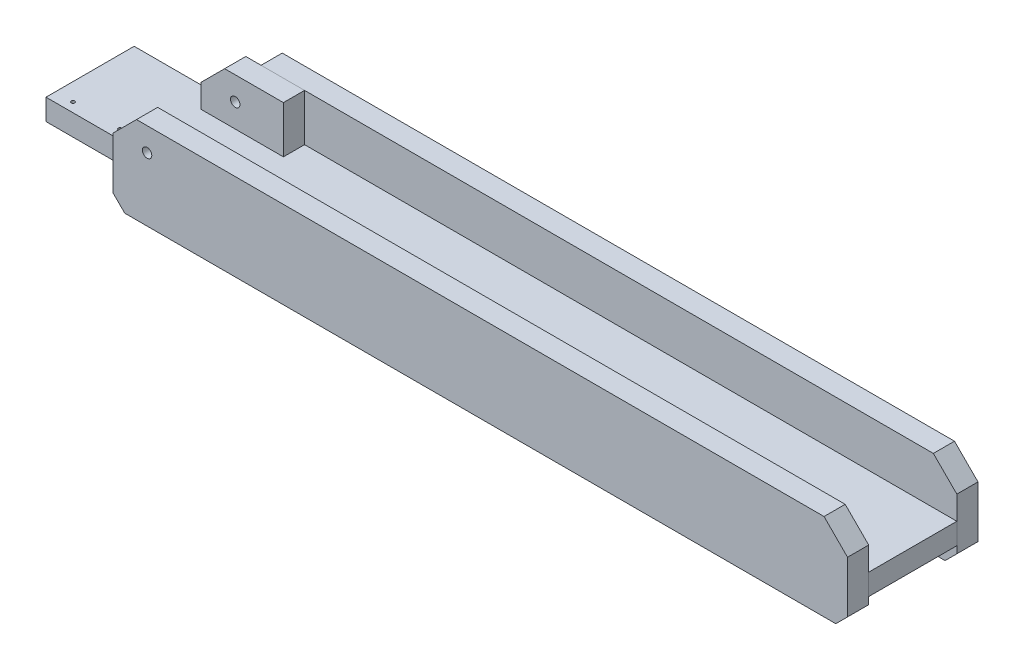
ISO-10303-21;
HEADER;
FILE_DESCRIPTION(('STEP AP214'),'2;1');
FILE_NAME('part.step','',(''),(''),'','','');
FILE_SCHEMA(('AUTOMOTIVE_DESIGN { 1 0 10303 214 1 1 1 1 }'));
ENDSEC;
DATA;
#1=APPLICATION_CONTEXT('core data for automotive mechanical design processes');
#2=APPLICATION_PROTOCOL_DEFINITION('international standard','automotive_design',2000,#1);
#3=PRODUCT_CONTEXT('',#1,'mechanical');
#4=PRODUCT('Part','Part','',(#3));
#5=PRODUCT_RELATED_PRODUCT_CATEGORY('part','',(#4));
#6=PRODUCT_DEFINITION_FORMATION('','',#4);
#7=PRODUCT_DEFINITION_CONTEXT('part definition',#1,'design');
#8=PRODUCT_DEFINITION('design','',#6,#7);
#9=PRODUCT_DEFINITION_SHAPE('','',#8);
#10=(LENGTH_UNIT() NAMED_UNIT(*) SI_UNIT(.MILLI.,.METRE.));
#11=(NAMED_UNIT(*) PLANE_ANGLE_UNIT() SI_UNIT($,.RADIAN.));
#12=(NAMED_UNIT(*) SI_UNIT($,.STERADIAN.) SOLID_ANGLE_UNIT());
#13=UNCERTAINTY_MEASURE_WITH_UNIT(LENGTH_MEASURE(1.E-05),#10,'distance_accuracy_value','');
#14=(GEOMETRIC_REPRESENTATION_CONTEXT(3) GLOBAL_UNCERTAINTY_ASSIGNED_CONTEXT((#13)) GLOBAL_UNIT_ASSIGNED_CONTEXT((#10,
#11,#12)) REPRESENTATION_CONTEXT('',''));
#15=CARTESIAN_POINT('',(0.,0.,0.));
#16=DIRECTION('',(0.,0.,1.));
#17=DIRECTION('',(1.,0.,0.));
#18=AXIS2_PLACEMENT_3D('',#15,#16,#17);
#19=CARTESIAN_POINT('',(379.872554582266,18.,-19.5));
#20=DIRECTION('',(0.,1.,0.));
#21=DIRECTION('',(0.,0.,1.));
#22=AXIS2_PLACEMENT_3D('',#19,#20,#21);
#23=PLANE('',#22);
#24=DIRECTION('',(1.,0.,0.));
#25=VECTOR('',#24,1.);
#26=CARTESIAN_POINT('',(379.872554582266,18.,-37.5));
#27=LINE('',#26,#25);
#28=CARTESIAN_POINT('',(75.,18.,-37.5));
#29=VERTEX_POINT('',#28);
#30=CARTESIAN_POINT('',(145.,18.,-37.5));
#31=VERTEX_POINT('',#30);
#32=EDGE_CURVE('E124',#29,#31,#27,.T.);
#33=ORIENTED_EDGE('',*,*,#32,.T.);
#34=DIRECTION('',(0.,0.,-1.));
#35=VECTOR('',#34,1.);
#36=CARTESIAN_POINT('',(145.,18.,-19.5));
#37=LINE('',#36,#35);
#38=CARTESIAN_POINT('',(145.,18.,-19.5));
#39=VERTEX_POINT('',#38);
#40=EDGE_CURVE('E12',#39,#31,#37,.T.);
#41=ORIENTED_EDGE('',*,*,#40,.F.);
#42=DIRECTION('',(1.,0.,0.));
#43=VECTOR('',#42,1.);
#44=CARTESIAN_POINT('',(379.872554582266,18.,-19.5));
#45=LINE('',#44,#43);
#46=CARTESIAN_POINT('',(75.,18.,-19.5));
#47=VERTEX_POINT('',#46);
#48=EDGE_CURVE('E140',#47,#39,#45,.T.);
#49=ORIENTED_EDGE('',*,*,#48,.F.);
#50=DIRECTION('',(0.,0.,-1.));
#51=VECTOR('',#50,1.);
#52=CARTESIAN_POINT('',(75.,18.,-19.5));
#53=LINE('',#52,#51);
#54=EDGE_CURVE('E117',#47,#29,#53,.T.);
#55=ORIENTED_EDGE('',*,*,#54,.T.);
#56=EDGE_LOOP('',(#33,#41,#49,#55));
#57=FACE_BOUND('',#56,.T.);
#58=ADVANCED_FACE('F46',(#57),#23,.F.);
#59=CARTESIAN_POINT('',(145.,-480.619058501836,-19.5));
#60=DIRECTION('',(-1.,0.,0.));
#61=DIRECTION('',(0.,0.,1.));
#62=AXIS2_PLACEMENT_3D('',#59,#60,#61);
#63=PLANE('',#62);
#64=DIRECTION('',(0.,1.,0.));
#65=VECTOR('',#64,1.);
#66=CARTESIAN_POINT('',(145.,-480.619058501836,-37.5));
#67=LINE('',#66,#65);
#68=CARTESIAN_POINT('',(145.,58.,-37.5));
#69=VERTEX_POINT('',#68);
#70=EDGE_CURVE('E127',#31,#69,#67,.T.);
#71=ORIENTED_EDGE('',*,*,#70,.T.);
#72=DIRECTION('',(0.,0.,-1.));
#73=VECTOR('',#72,1.);
#74=CARTESIAN_POINT('',(145.,58.,-19.5));
#75=LINE('',#74,#73);
#76=CARTESIAN_POINT('',(145.,58.,-19.5));
#77=VERTEX_POINT('',#76);
#78=EDGE_CURVE('E55',#77,#69,#75,.T.);
#79=ORIENTED_EDGE('',*,*,#78,.F.);
#80=DIRECTION('',(0.,1.,0.));
#81=VECTOR('',#80,1.);
#82=CARTESIAN_POINT('',(145.,-480.619058501836,-19.5));
#83=LINE('',#82,#81);
#84=EDGE_CURVE('E97',#39,#77,#83,.T.);
#85=ORIENTED_EDGE('',*,*,#84,.F.);
#86=ORIENTED_EDGE('',*,*,#40,.T.);
#87=EDGE_LOOP('',(#71,#79,#85,#86));
#88=FACE_BOUND('',#87,.T.);
#89=ADVANCED_FACE('F154',(#88),#63,.F.);
#90=CARTESIAN_POINT('',(379.872554582266,58.,-19.5));
#91=DIRECTION('',(0.,-1.,0.));
#92=DIRECTION('',(1.,0.,0.));
#93=AXIS2_PLACEMENT_3D('',#90,#91,#92);
#94=PLANE('',#93);
#95=DIRECTION('',(-1.,0.,0.));
#96=VECTOR('',#95,1.);
#97=CARTESIAN_POINT('',(379.872554582266,58.,-37.5));
#98=LINE('',#97,#96);
#99=CARTESIAN_POINT('',(95.0000000000001,57.9999999999999,-37.5));
#100=VERTEX_POINT('',#99);
#101=EDGE_CURVE('E112',#69,#100,#98,.T.);
#102=ORIENTED_EDGE('',*,*,#101,.T.);
#103=DIRECTION('',(0.,0.,-1.));
#104=VECTOR('',#103,1.);
#105=CARTESIAN_POINT('',(95.0000000000001,57.9999999999999,-19.5));
#106=LINE('',#105,#104);
#107=CARTESIAN_POINT('',(95.0000000000001,57.9999999999999,-19.5));
#108=VERTEX_POINT('',#107);
#109=EDGE_CURVE('E109',#108,#100,#106,.T.);
#110=ORIENTED_EDGE('',*,*,#109,.F.);
#111=DIRECTION('',(-1.,0.,0.));
#112=VECTOR('',#111,1.);
#113=CARTESIAN_POINT('',(379.872554582266,58.,-19.5));
#114=LINE('',#113,#112);
#115=EDGE_CURVE('E101',#77,#108,#114,.T.);
#116=ORIENTED_EDGE('',*,*,#115,.F.);
#117=ORIENTED_EDGE('',*,*,#78,.T.);
#118=EDGE_LOOP('',(#102,#110,#116,#117));
#119=FACE_BOUND('',#118,.T.);
#120=ADVANCED_FACE('F110',(#119),#94,.F.);
#121=CARTESIAN_POINT('',(-31.8732519597839,-68.8732519597835,-19.5));
#122=DIRECTION('',(0.707106781186546,-0.707106781186549,0.));
#123=DIRECTION('',(0.707106781186549,0.707106781186546,0.));
#124=AXIS2_PLACEMENT_3D('',#121,#122,#123);
#125=PLANE('',#124);
#126=DIRECTION('',(-0.707106781186549,-0.707106781186546,0.));
#127=VECTOR('',#126,1.);
#128=CARTESIAN_POINT('',(-31.8732519597839,-68.8732519597835,-37.5));
#129=LINE('',#128,#127);
#130=CARTESIAN_POINT('',(75.,37.9999999999999,-37.5));
#131=VERTEX_POINT('',#130);
#132=EDGE_CURVE('E83',#100,#131,#129,.T.);
#133=ORIENTED_EDGE('',*,*,#132,.T.);
#134=DIRECTION('',(0.,0.,-1.));
#135=VECTOR('',#134,1.);
#136=CARTESIAN_POINT('',(75.,37.9999999999999,-19.5));
#137=LINE('',#136,#135);
#138=CARTESIAN_POINT('',(75.,37.9999999999999,-19.5));
#139=VERTEX_POINT('',#138);
#140=EDGE_CURVE('E113',#139,#131,#137,.T.);
#141=ORIENTED_EDGE('',*,*,#140,.F.);
#142=DIRECTION('',(-0.707106781186549,-0.707106781186546,0.));
#143=VECTOR('',#142,1.);
#144=CARTESIAN_POINT('',(-31.8732519597839,-68.8732519597835,-19.5));
#145=LINE('',#144,#143);
#146=EDGE_CURVE('E105',#108,#139,#145,.T.);
#147=ORIENTED_EDGE('',*,*,#146,.F.);
#148=ORIENTED_EDGE('',*,*,#109,.T.);
#149=EDGE_LOOP('',(#133,#141,#147,#148));
#150=FACE_BOUND('',#149,.T.);
#151=ADVANCED_FACE('F115',(#150),#125,.F.);
#152=CARTESIAN_POINT('',(104.,38.,-19.5));
#153=DIRECTION('',(0.,0.,-1.));
#154=DIRECTION('',(-1.,0.,0.));
#155=AXIS2_PLACEMENT_3D('',#152,#153,#154);
#156=CYLINDRICAL_SURFACE('',#155,4.00000000000001);
#157=CARTESIAN_POINT('',(104.,38.,-19.5));
#158=DIRECTION('',(0.,0.,1.));
#159=DIRECTION('',(1.,0.,0.));
#160=AXIS2_PLACEMENT_3D('',#157,#158,#159);
#161=CIRCLE('',#160,4.00000000000001);
#162=CARTESIAN_POINT('',(108.,38.,-19.5));
#163=VERTEX_POINT('',#162);
#164=EDGE_CURVE('E132',#163,#163,#161,.F.);
#165=ORIENTED_EDGE('',*,*,#164,.F.);
#166=EDGE_LOOP('',(#165));
#167=FACE_BOUND('',#166,.T.);
#168=CARTESIAN_POINT('',(104.,38.,-37.5));
#169=DIRECTION('',(0.,0.,1.));
#170=DIRECTION('',(1.,0.,0.));
#171=AXIS2_PLACEMENT_3D('',#168,#169,#170);
#172=CIRCLE('',#171,4.00000000000001);
#173=CARTESIAN_POINT('',(108.,38.,-37.5));
#174=VERTEX_POINT('',#173);
#175=EDGE_CURVE('E121',#174,#174,#172,.F.);
#176=ORIENTED_EDGE('',*,*,#175,.T.);
#177=EDGE_LOOP('',(#176));
#178=FACE_BOUND('',#177,.T.);
#179=ADVANCED_FACE('F48',(#167,#178),#156,.F.);
#180=CARTESIAN_POINT('',(75.,-480.619058501836,-19.5));
#181=DIRECTION('',(1.,0.,0.));
#182=DIRECTION('',(0.,0.,-1.));
#183=AXIS2_PLACEMENT_3D('',#180,#181,#182);
#184=PLANE('',#183);
#185=DIRECTION('',(0.,-1.,0.));
#186=VECTOR('',#185,1.);
#187=CARTESIAN_POINT('',(75.,-480.619058501836,-37.5));
#188=LINE('',#187,#186);
#189=EDGE_CURVE('E89',#131,#29,#188,.T.);
#190=ORIENTED_EDGE('',*,*,#189,.T.);
#191=ORIENTED_EDGE('',*,*,#54,.F.);
#192=DIRECTION('',(0.,-1.,0.));
#193=VECTOR('',#192,1.);
#194=CARTESIAN_POINT('',(75.,-480.619058501836,-19.5));
#195=LINE('',#194,#193);
#196=EDGE_CURVE('E63',#139,#47,#195,.T.);
#197=ORIENTED_EDGE('',*,*,#196,.F.);
#198=ORIENTED_EDGE('',*,*,#140,.T.);
#199=EDGE_LOOP('',(#190,#191,#197,#198));
#200=FACE_BOUND('',#199,.T.);
#201=ADVANCED_FACE('F141',(#200),#184,.F.);
#202=CARTESIAN_POINT('',(379.872554582266,-480.619058501836,-19.5));
#203=DIRECTION('',(0.,0.,1.));
#204=DIRECTION('',(1.,0.,0.));
#205=AXIS2_PLACEMENT_3D('',#202,#203,#204);
#206=PLANE('',#205);
#207=ORIENTED_EDGE('',*,*,#164,.T.);
#208=EDGE_LOOP('',(#207));
#209=FACE_BOUND('',#208,.T.);
#210=ORIENTED_EDGE('',*,*,#48,.T.);
#211=ORIENTED_EDGE('',*,*,#84,.T.);
#212=ORIENTED_EDGE('',*,*,#115,.T.);
#213=ORIENTED_EDGE('',*,*,#146,.T.);
#214=ORIENTED_EDGE('',*,*,#196,.T.);
#215=EDGE_LOOP('',(#210,#211,#212,#213,#214));
#216=FACE_BOUND('',#215,.T.);
#217=ADVANCED_FACE('F103',(#209,#216),#206,.T.);
#218=CARTESIAN_POINT('',(379.872554582266,-480.619058501836,-37.5));
#219=DIRECTION('',(0.,0.,1.));
#220=DIRECTION('',(1.,0.,0.));
#221=AXIS2_PLACEMENT_3D('',#218,#219,#220);
#222=PLANE('',#221);
#223=ORIENTED_EDGE('',*,*,#175,.F.);
#224=EDGE_LOOP('',(#223));
#225=FACE_BOUND('',#224,.T.);
#226=ORIENTED_EDGE('',*,*,#32,.F.);
#227=ORIENTED_EDGE('',*,*,#189,.F.);
#228=ORIENTED_EDGE('',*,*,#132,.F.);
#229=ORIENTED_EDGE('',*,*,#101,.F.);
#230=ORIENTED_EDGE('',*,*,#70,.F.);
#231=EDGE_LOOP('',(#226,#227,#228,#229,#230));
#232=FACE_BOUND('',#231,.T.);
#233=ADVANCED_FACE('F136',(#225,#232),#222,.F.);
#234=CLOSED_SHELL('',(#58,#89,#120,#151,#179,#201,#217,#233));
#235=MANIFOLD_SOLID_BREP('B2',#234);
#236=CARTESIAN_POINT('',(700.,-16.,-55.5));
#237=DIRECTION('',(0.,0.,1.));
#238=DIRECTION('',(-1.,0.,0.));
#239=AXIS2_PLACEMENT_3D('',#236,#237,#238);
#240=PLANE('',#239);
#241=DIRECTION('',(0.,-1.,0.));
#242=VECTOR('',#241,1.);
#243=CARTESIAN_POINT('',(108.,57.9999999999999,-55.5));
#244=LINE('',#243,#242);
#245=CARTESIAN_POINT('',(108.,57.9999999999999,-55.5));
#246=VERTEX_POINT('',#245);
#247=CARTESIAN_POINT('',(108.,-16.0000000000001,-55.5));
#248=VERTEX_POINT('',#247);
#249=EDGE_CURVE('E254',#246,#248,#244,.T.);
#250=ORIENTED_EDGE('',*,*,#249,.F.);
#251=DIRECTION('',(-1.,0.,0.));
#252=VECTOR('',#251,1.);
#253=CARTESIAN_POINT('',(700.,58.,-55.5));
#254=LINE('',#253,#252);
#255=CARTESIAN_POINT('',(680.,58.,-55.5));
#256=VERTEX_POINT('',#255);
#257=EDGE_CURVE('E308',#256,#246,#254,.T.);
#258=ORIENTED_EDGE('',*,*,#257,.F.);
#259=DIRECTION('',(0.707106781186547,-0.707106781186549,0.));
#260=VECTOR('',#259,1.);
#261=CARTESIAN_POINT('',(680.,58.,-55.5));
#262=LINE('',#261,#260);
#263=CARTESIAN_POINT('',(700.,37.9999999999999,-55.5));
#264=VERTEX_POINT('',#263);
#265=EDGE_CURVE('E327',#264,#256,#262,.F.);
#266=ORIENTED_EDGE('',*,*,#265,.F.);
#267=DIRECTION('',(0.,1.,0.));
#268=VECTOR('',#267,1.);
#269=CARTESIAN_POINT('',(700.,58.,-55.5));
#270=LINE('',#269,#268);
#271=CARTESIAN_POINT('',(700.,-6.00000000000001,-55.5));
#272=VERTEX_POINT('',#271);
#273=EDGE_CURVE('E317',#272,#264,#270,.T.);
#274=ORIENTED_EDGE('',*,*,#273,.F.);
#275=DIRECTION('',(-0.707106781186551,-0.707106781186544,0.));
#276=VECTOR('',#275,1.);
#277=CARTESIAN_POINT('',(700.,-6.,-55.5));
#278=LINE('',#277,#276);
#279=CARTESIAN_POINT('',(690.,-16.,-55.5));
#280=VERTEX_POINT('',#279);
#281=EDGE_CURVE('E44',#280,#272,#278,.F.);
#282=ORIENTED_EDGE('',*,*,#281,.F.);
#283=DIRECTION('',(1.,0.,0.));
#284=VECTOR('',#283,1.);
#285=CARTESIAN_POINT('',(700.,-16.,-55.5));
#286=LINE('',#285,#284);
#287=EDGE_CURVE('E261',#248,#280,#286,.T.);
#288=ORIENTED_EDGE('',*,*,#287,.F.);
#289=EDGE_LOOP('',(#250,#258,#266,#274,#282,#288));
#290=FACE_BOUND('',#289,.T.);
#291=ADVANCED_FACE('F239',(#290),#240,.F.);
#292=CARTESIAN_POINT('',(700.,-16.,-37.5));
#293=DIRECTION('',(0.,0.,1.));
#294=DIRECTION('',(-1.,0.,0.));
#295=AXIS2_PLACEMENT_3D('',#292,#293,#294);
#296=PLANE('',#295);
#297=DIRECTION('',(-1.,0.,0.));
#298=VECTOR('',#297,1.);
#299=CARTESIAN_POINT('',(700.,58.,-37.5));
#300=LINE('',#299,#298);
#301=CARTESIAN_POINT('',(680.,58.,-37.5));
#302=VERTEX_POINT('',#301);
#303=CARTESIAN_POINT('',(108.,57.9999999999999,-37.5));
#304=VERTEX_POINT('',#303);
#305=EDGE_CURVE('E305',#302,#304,#300,.T.);
#306=ORIENTED_EDGE('',*,*,#305,.T.);
#307=DIRECTION('',(0.,1.,0.));
#308=VECTOR('',#307,1.);
#309=CARTESIAN_POINT('',(108.,-16.0000000000001,-37.5));
#310=LINE('',#309,#308);
#311=CARTESIAN_POINT('',(108.,-16.0000000000001,-37.5));
#312=VERTEX_POINT('',#311);
#313=EDGE_CURVE('E291',#312,#304,#310,.T.);
#314=ORIENTED_EDGE('',*,*,#313,.F.);
#315=DIRECTION('',(1.,0.,0.));
#316=VECTOR('',#315,1.);
#317=CARTESIAN_POINT('',(700.,-16.,-37.5));
#318=LINE('',#317,#316);
#319=CARTESIAN_POINT('',(690.,-16.,-37.5));
#320=VERTEX_POINT('',#319);
#321=EDGE_CURVE('E314',#312,#320,#318,.T.);
#322=ORIENTED_EDGE('',*,*,#321,.T.);
#323=DIRECTION('',(0.707106781186551,0.707106781186544,0.));
#324=VECTOR('',#323,1.);
#325=CARTESIAN_POINT('',(695.,-10.9999999999999,-37.5));
#326=LINE('',#325,#324);
#327=CARTESIAN_POINT('',(700.,-6.00000000000001,-37.5));
#328=VERTEX_POINT('',#327);
#329=EDGE_CURVE('E332',#328,#320,#326,.F.);
#330=ORIENTED_EDGE('',*,*,#329,.F.);
#331=DIRECTION('',(0.,1.,0.));
#332=VECTOR('',#331,1.);
#333=CARTESIAN_POINT('',(700.,58.,-37.5));
#334=LINE('',#333,#332);
#335=CARTESIAN_POINT('',(700.,37.9999999999999,-37.5));
#336=VERTEX_POINT('',#335);
#337=EDGE_CURVE('E315',#328,#336,#334,.T.);
#338=ORIENTED_EDGE('',*,*,#337,.T.);
#339=DIRECTION('',(-0.707106781186547,0.707106781186549,0.));
#340=VECTOR('',#339,1.);
#341=CARTESIAN_POINT('',(727.,10.9999999999999,-37.5));
#342=LINE('',#341,#340);
#343=EDGE_CURVE('E313',#302,#336,#342,.F.);
#344=ORIENTED_EDGE('',*,*,#343,.F.);
#345=EDGE_LOOP('',(#306,#314,#322,#330,#338,#344));
#346=FACE_BOUND('',#345,.T.);
#347=ADVANCED_FACE('F310',(#346),#296,.T.);
#348=CARTESIAN_POINT('',(700.,58.,-55.5));
#349=DIRECTION('',(0.,-1.,0.));
#350=DIRECTION('',(1.,0.,0.));
#351=AXIS2_PLACEMENT_3D('',#348,#349,#350);
#352=PLANE('',#351);
#353=DIRECTION('',(0.,0.,-1.));
#354=VECTOR('',#353,1.);
#355=CARTESIAN_POINT('',(108.,57.9999999999999,-37.5));
#356=LINE('',#355,#354);
#357=EDGE_CURVE('E294',#304,#246,#356,.T.);
#358=ORIENTED_EDGE('',*,*,#357,.F.);
#359=ORIENTED_EDGE('',*,*,#305,.F.);
#360=DIRECTION('',(0.,0.,1.));
#361=VECTOR('',#360,1.);
#362=CARTESIAN_POINT('',(680.,58.,-55.5));
#363=LINE('',#362,#361);
#364=EDGE_CURVE('E322',#256,#302,#363,.T.);
#365=ORIENTED_EDGE('',*,*,#364,.F.);
#366=ORIENTED_EDGE('',*,*,#257,.T.);
#367=EDGE_LOOP('',(#358,#359,#365,#366));
#368=FACE_BOUND('',#367,.T.);
#369=ADVANCED_FACE('F304',(#368),#352,.F.);
#370=CARTESIAN_POINT('',(700.,-16.,-55.5));
#371=DIRECTION('',(0.,1.,0.));
#372=DIRECTION('',(-1.,0.,0.));
#373=AXIS2_PLACEMENT_3D('',#370,#371,#372);
#374=PLANE('',#373);
#375=DIRECTION('',(0.,0.,1.));
#376=VECTOR('',#375,1.);
#377=CARTESIAN_POINT('',(108.,-16.0000000000001,-55.5));
#378=LINE('',#377,#376);
#379=EDGE_CURVE('E295',#248,#312,#378,.T.);
#380=ORIENTED_EDGE('',*,*,#379,.F.);
#381=ORIENTED_EDGE('',*,*,#287,.T.);
#382=DIRECTION('',(0.,0.,-1.));
#383=VECTOR('',#382,1.);
#384=CARTESIAN_POINT('',(690.,-16.,-55.5));
#385=LINE('',#384,#383);
#386=EDGE_CURVE('E247',#320,#280,#385,.T.);
#387=ORIENTED_EDGE('',*,*,#386,.F.);
#388=ORIENTED_EDGE('',*,*,#321,.F.);
#389=EDGE_LOOP('',(#380,#381,#387,#388));
#390=FACE_BOUND('',#389,.T.);
#391=ADVANCED_FACE('F390',(#390),#374,.F.);
#392=CARTESIAN_POINT('',(700.,58.,-55.5));
#393=DIRECTION('',(-1.,0.,0.));
#394=DIRECTION('',(0.,0.,-1.));
#395=AXIS2_PLACEMENT_3D('',#392,#393,#394);
#396=PLANE('',#395);
#397=ORIENTED_EDGE('',*,*,#273,.T.);
#398=DIRECTION('',(0.,0.,-1.));
#399=VECTOR('',#398,1.);
#400=CARTESIAN_POINT('',(700.,37.9999999999999,-55.5));
#401=LINE('',#400,#399);
#402=EDGE_CURVE('E325',#336,#264,#401,.T.);
#403=ORIENTED_EDGE('',*,*,#402,.F.);
#404=ORIENTED_EDGE('',*,*,#337,.F.);
#405=DIRECTION('',(0.,0.,1.));
#406=VECTOR('',#405,1.);
#407=CARTESIAN_POINT('',(700.,-6.,-55.5));
#408=LINE('',#407,#406);
#409=EDGE_CURVE('E330',#272,#328,#408,.T.);
#410=ORIENTED_EDGE('',*,*,#409,.F.);
#411=EDGE_LOOP('',(#397,#403,#404,#410));
#412=FACE_BOUND('',#411,.T.);
#413=ADVANCED_FACE('F393',(#412),#396,.F.);
#414=CARTESIAN_POINT('',(680.,58.,-55.5));
#415=DIRECTION('',(-0.707106781186549,-0.707106781186547,0.));
#416=DIRECTION('',(0.707106781186547,-0.707106781186549,0.));
#417=AXIS2_PLACEMENT_3D('',#414,#415,#416);
#418=PLANE('',#417);
#419=ORIENTED_EDGE('',*,*,#265,.T.);
#420=ORIENTED_EDGE('',*,*,#364,.T.);
#421=ORIENTED_EDGE('',*,*,#343,.T.);
#422=ORIENTED_EDGE('',*,*,#402,.T.);
#423=EDGE_LOOP('',(#419,#420,#421,#422));
#424=FACE_BOUND('',#423,.T.);
#425=ADVANCED_FACE('F397',(#424),#418,.F.);
#426=CARTESIAN_POINT('',(700.,-6.,-55.5));
#427=DIRECTION('',(-0.707106781186543,0.707106781186551,0.));
#428=DIRECTION('',(-0.707106781186551,-0.707106781186544,0.));
#429=AXIS2_PLACEMENT_3D('',#426,#427,#428);
#430=PLANE('',#429);
#431=ORIENTED_EDGE('',*,*,#281,.T.);
#432=ORIENTED_EDGE('',*,*,#409,.T.);
#433=ORIENTED_EDGE('',*,*,#329,.T.);
#434=ORIENTED_EDGE('',*,*,#386,.T.);
#435=EDGE_LOOP('',(#431,#432,#433,#434));
#436=FACE_BOUND('',#435,.T.);
#437=ADVANCED_FACE('F241',(#436),#430,.F.);
#438=CARTESIAN_POINT('',(108.,57.9999999999999,-37.5));
#439=DIRECTION('',(-1.,0.,0.));
#440=DIRECTION('',(0.,0.,1.));
#441=AXIS2_PLACEMENT_3D('',#438,#439,#440);
#442=PLANE('',#441);
#443=CARTESIAN_POINT('',(108.,38.9999999999999,-45.5));
#444=DIRECTION('',(-1.,0.,0.));
#445=DIRECTION('',(0.,0.,1.));
#446=AXIS2_PLACEMENT_3D('',#443,#444,#445);
#447=CIRCLE('',#446,1.5);
#448=CARTESIAN_POINT('',(108.,38.9999999999999,-44.));
#449=VERTEX_POINT('',#448);
#450=EDGE_CURVE('E353',#449,#449,#447,.T.);
#451=ORIENTED_EDGE('',*,*,#450,.F.);
#452=EDGE_LOOP('',(#451));
#453=FACE_BOUND('',#452,.T.);
#454=CARTESIAN_POINT('',(108.,-1.00000000000015,-45.5));
#455=DIRECTION('',(-1.,0.,0.));
#456=DIRECTION('',(0.,0.,1.));
#457=AXIS2_PLACEMENT_3D('',#454,#455,#456);
#458=CIRCLE('',#457,1.5);
#459=CARTESIAN_POINT('',(108.,-1.00000000000015,-44.));
#460=VERTEX_POINT('',#459);
#461=EDGE_CURVE('E347',#460,#460,#458,.T.);
#462=ORIENTED_EDGE('',*,*,#461,.F.);
#463=EDGE_LOOP('',(#462));
#464=FACE_BOUND('',#463,.T.);
#465=ORIENTED_EDGE('',*,*,#249,.T.);
#466=ORIENTED_EDGE('',*,*,#379,.T.);
#467=ORIENTED_EDGE('',*,*,#313,.T.);
#468=ORIENTED_EDGE('',*,*,#357,.T.);
#469=EDGE_LOOP('',(#465,#466,#467,#468));
#470=FACE_BOUND('',#469,.T.);
#471=ADVANCED_FACE('F293',(#453,#464,#470),#442,.T.);
#472=CARTESIAN_POINT('',(118.,-1.00000000000015,-45.5));
#473=DIRECTION('',(-1.,0.,0.));
#474=DIRECTION('',(0.,0.,1.));
#475=AXIS2_PLACEMENT_3D('',#472,#473,#474);
#476=CYLINDRICAL_SURFACE('',#475,1.5);
#477=CARTESIAN_POINT('',(118.,-1.00000000000015,-45.5));
#478=DIRECTION('',(-1.,0.,0.));
#479=DIRECTION('',(0.,0.,1.));
#480=AXIS2_PLACEMENT_3D('',#477,#478,#479);
#481=CIRCLE('',#480,1.5);
#482=CARTESIAN_POINT('',(118.,-1.00000000000015,-44.));
#483=VERTEX_POINT('',#482);
#484=EDGE_CURVE('E299',#483,#483,#481,.T.);
#485=ORIENTED_EDGE('',*,*,#484,.F.);
#486=EDGE_LOOP('',(#485));
#487=FACE_BOUND('',#486,.T.);
#488=ORIENTED_EDGE('',*,*,#461,.T.);
#489=EDGE_LOOP('',(#488));
#490=FACE_BOUND('',#489,.T.);
#491=ADVANCED_FACE('F370',(#487,#490),#476,.F.);
#492=CARTESIAN_POINT('',(118.,-1.00000000000015,-45.5));
#493=DIRECTION('',(-1.,0.,0.));
#494=DIRECTION('',(0.,0.,1.));
#495=AXIS2_PLACEMENT_3D('',#492,#493,#494);
#496=PLANE('',#495);
#497=ORIENTED_EDGE('',*,*,#484,.T.);
#498=EDGE_LOOP('',(#497));
#499=FACE_BOUND('',#498,.T.);
#500=ADVANCED_FACE('F364',(#499),#496,.T.);
#501=CARTESIAN_POINT('',(118.,38.9999999999999,-45.5));
#502=DIRECTION('',(-1.,0.,0.));
#503=DIRECTION('',(0.,0.,1.));
#504=AXIS2_PLACEMENT_3D('',#501,#502,#503);
#505=CYLINDRICAL_SURFACE('',#504,1.5);
#506=CARTESIAN_POINT('',(118.,38.9999999999999,-45.5));
#507=DIRECTION('',(-1.,0.,0.));
#508=DIRECTION('',(0.,0.,1.));
#509=AXIS2_PLACEMENT_3D('',#506,#507,#508);
#510=CIRCLE('',#509,1.5);
#511=CARTESIAN_POINT('',(118.,38.9999999999999,-44.));
#512=VERTEX_POINT('',#511);
#513=EDGE_CURVE('E350',#512,#512,#510,.T.);
#514=ORIENTED_EDGE('',*,*,#513,.F.);
#515=EDGE_LOOP('',(#514));
#516=FACE_BOUND('',#515,.T.);
#517=ORIENTED_EDGE('',*,*,#450,.T.);
#518=EDGE_LOOP('',(#517));
#519=FACE_BOUND('',#518,.T.);
#520=ADVANCED_FACE('F361',(#516,#519),#505,.F.);
#521=CARTESIAN_POINT('',(118.,38.9999999999999,-45.5));
#522=DIRECTION('',(-1.,0.,0.));
#523=DIRECTION('',(0.,0.,1.));
#524=AXIS2_PLACEMENT_3D('',#521,#522,#523);
#525=PLANE('',#524);
#526=ORIENTED_EDGE('',*,*,#513,.T.);
#527=EDGE_LOOP('',(#526));
#528=FACE_BOUND('',#527,.T.);
#529=ADVANCED_FACE('F359',(#528),#525,.T.);
#530=CLOSED_SHELL('',(#291,#347,#369,#391,#413,#425,#437,#471,#491,#500,#520,#529));
#531=MANIFOLD_SOLID_BREP('B6',#530);
#532=CARTESIAN_POINT('',(700.,-16.,55.5));
#533=DIRECTION('',(0.,0.,-1.));
#534=DIRECTION('',(-1.,0.,0.));
#535=AXIS2_PLACEMENT_3D('',#532,#533,#534);
#536=PLANE('',#535);
#537=DIRECTION('',(1.,0.,0.));
#538=VECTOR('',#537,1.);
#539=CARTESIAN_POINT('',(700.,-16.,55.5));
#540=LINE('',#539,#538);
#541=CARTESIAN_POINT('',(85.,-16.0000000000001,55.5));
#542=VERTEX_POINT('',#541);
#543=CARTESIAN_POINT('',(690.,-16.,55.5));
#544=VERTEX_POINT('',#543);
#545=EDGE_CURVE('E588',#542,#544,#540,.T.);
#546=ORIENTED_EDGE('',*,*,#545,.T.);
#547=DIRECTION('',(-0.707106781186551,-0.707106781186544,0.));
#548=VECTOR('',#547,1.);
#549=CARTESIAN_POINT('',(700.,-6.,55.5));
#550=LINE('',#549,#548);
#551=CARTESIAN_POINT('',(700.,-6.00000000000001,55.5));
#552=VERTEX_POINT('',#551);
#553=EDGE_CURVE('E492',#544,#552,#550,.F.);
#554=ORIENTED_EDGE('',*,*,#553,.T.);
#555=DIRECTION('',(0.,1.,0.));
#556=VECTOR('',#555,1.);
#557=CARTESIAN_POINT('',(700.,58.,55.5));
#558=LINE('',#557,#556);
#559=CARTESIAN_POINT('',(700.,37.9999999999999,55.5));
#560=VERTEX_POINT('',#559);
#561=EDGE_CURVE('E587',#552,#560,#558,.T.);
#562=ORIENTED_EDGE('',*,*,#561,.T.);
#563=DIRECTION('',(0.707106781186547,-0.707106781186549,0.));
#564=VECTOR('',#563,1.);
#565=CARTESIAN_POINT('',(680.,58.,55.5));
#566=LINE('',#565,#564);
#567=CARTESIAN_POINT('',(680.,58.,55.5));
#568=VERTEX_POINT('',#567);
#569=EDGE_CURVE('E594',#560,#568,#566,.F.);
#570=ORIENTED_EDGE('',*,*,#569,.T.);
#571=DIRECTION('',(-1.,0.,0.));
#572=VECTOR('',#571,1.);
#573=CARTESIAN_POINT('',(700.,58.,55.5));
#574=LINE('',#573,#572);
#575=CARTESIAN_POINT('',(95.,57.9999999999999,55.5));
#576=VERTEX_POINT('',#575);
#577=EDGE_CURVE('E571',#568,#576,#574,.T.);
#578=ORIENTED_EDGE('',*,*,#577,.T.);
#579=DIRECTION('',(0.707106781186549,0.707106781186546,0.));
#580=VECTOR('',#579,1.);
#581=CARTESIAN_POINT('',(75.,37.9999999999999,55.5));
#582=LINE('',#581,#580);
#583=CARTESIAN_POINT('',(75.,37.9999999999999,55.5));
#584=VERTEX_POINT('',#583);
#585=EDGE_CURVE('E592',#576,#584,#582,.F.);
#586=ORIENTED_EDGE('',*,*,#585,.T.);
#587=DIRECTION('',(0.,-1.,0.));
#588=VECTOR('',#587,1.);
#589=CARTESIAN_POINT('',(75.,57.9999999999999,55.5));
#590=LINE('',#589,#588);
#591=CARTESIAN_POINT('',(75.,-6.00000000000002,55.5));
#592=VERTEX_POINT('',#591);
#593=EDGE_CURVE('E628',#584,#592,#590,.T.);
#594=ORIENTED_EDGE('',*,*,#593,.T.);
#595=DIRECTION('',(-0.707106781186546,0.707106781186549,0.));
#596=VECTOR('',#595,1.);
#597=CARTESIAN_POINT('',(85.,-16.0000000000001,55.5));
#598=LINE('',#597,#596);
#599=EDGE_CURVE('E610',#592,#542,#598,.F.);
#600=ORIENTED_EDGE('',*,*,#599,.T.);
#601=EDGE_LOOP('',(#546,#554,#562,#570,#578,#586,#594,#600));
#602=FACE_BOUND('',#601,.T.);
#603=CARTESIAN_POINT('',(104.,38.,55.5));
#604=DIRECTION('',(0.,0.,1.));
#605=DIRECTION('',(1.,0.,0.));
#606=AXIS2_PLACEMENT_3D('',#603,#604,#605);
#607=CIRCLE('',#606,4.00000000000001);
#608=CARTESIAN_POINT('',(108.,38.,55.5));
#609=VERTEX_POINT('',#608);
#610=EDGE_CURVE('E582',#609,#609,#607,.T.);
#611=ORIENTED_EDGE('',*,*,#610,.F.);
#612=EDGE_LOOP('',(#611));
#613=FACE_BOUND('',#612,.T.);
#614=ADVANCED_FACE('F484',(#602,#613),#536,.F.);
#615=CARTESIAN_POINT('',(700.,-16.,37.5));
#616=DIRECTION('',(0.,0.,-1.));
#617=DIRECTION('',(-1.,0.,0.));
#618=AXIS2_PLACEMENT_3D('',#615,#616,#617);
#619=PLANE('',#618);
#620=DIRECTION('',(0.,1.,0.));
#621=VECTOR('',#620,1.);
#622=CARTESIAN_POINT('',(700.,58.,37.5));
#623=LINE('',#622,#621);
#624=CARTESIAN_POINT('',(700.,-6.00000000000001,37.5));
#625=VERTEX_POINT('',#624);
#626=CARTESIAN_POINT('',(700.,37.9999999999999,37.5));
#627=VERTEX_POINT('',#626);
#628=EDGE_CURVE('E578',#625,#627,#623,.T.);
#629=ORIENTED_EDGE('',*,*,#628,.F.);
#630=DIRECTION('',(0.707106781186551,0.707106781186544,0.));
#631=VECTOR('',#630,1.);
#632=CARTESIAN_POINT('',(695.,-10.9999999999999,37.5));
#633=LINE('',#632,#631);
#634=CARTESIAN_POINT('',(690.,-16.,37.5));
#635=VERTEX_POINT('',#634);
#636=EDGE_CURVE('E604',#625,#635,#633,.F.);
#637=ORIENTED_EDGE('',*,*,#636,.T.);
#638=DIRECTION('',(1.,0.,0.));
#639=VECTOR('',#638,1.);
#640=CARTESIAN_POINT('',(700.,-16.,37.5));
#641=LINE('',#640,#639);
#642=CARTESIAN_POINT('',(85.,-16.0000000000001,37.5));
#643=VERTEX_POINT('',#642);
#644=EDGE_CURVE('E580',#643,#635,#641,.T.);
#645=ORIENTED_EDGE('',*,*,#644,.F.);
#646=DIRECTION('',(0.707106781186546,-0.707106781186549,0.));
#647=VECTOR('',#646,1.);
#648=CARTESIAN_POINT('',(392.499999999998,-323.5,37.5));
#649=LINE('',#648,#647);
#650=CARTESIAN_POINT('',(75.,-6.00000000000001,37.5));
#651=VERTEX_POINT('',#650);
#652=EDGE_CURVE('E602',#643,#651,#649,.F.);
#653=ORIENTED_EDGE('',*,*,#652,.T.);
#654=DIRECTION('',(0.,-1.,0.));
#655=VECTOR('',#654,1.);
#656=CARTESIAN_POINT('',(75.,57.9999999999999,37.5));
#657=LINE('',#656,#655);
#658=CARTESIAN_POINT('',(75.,37.9999999999999,37.5));
#659=VERTEX_POINT('',#658);
#660=EDGE_CURVE('E577',#659,#651,#657,.T.);
#661=ORIENTED_EDGE('',*,*,#660,.F.);
#662=DIRECTION('',(-0.707106781186549,-0.707106781186546,0.));
#663=VECTOR('',#662,1.);
#664=CARTESIAN_POINT('',(360.500000000002,323.5,37.5));
#665=LINE('',#664,#663);
#666=CARTESIAN_POINT('',(95.0000000000001,57.9999999999999,37.5));
#667=VERTEX_POINT('',#666);
#668=EDGE_CURVE('E562',#659,#667,#665,.F.);
#669=ORIENTED_EDGE('',*,*,#668,.T.);
#670=DIRECTION('',(-1.,0.,0.));
#671=VECTOR('',#670,1.);
#672=CARTESIAN_POINT('',(700.,58.,37.5));
#673=LINE('',#672,#671);
#674=CARTESIAN_POINT('',(680.,58.,37.5));
#675=VERTEX_POINT('',#674);
#676=EDGE_CURVE('E568',#675,#667,#673,.T.);
#677=ORIENTED_EDGE('',*,*,#676,.F.);
#678=DIRECTION('',(-0.707106781186547,0.707106781186549,0.));
#679=VECTOR('',#678,1.);
#680=CARTESIAN_POINT('',(727.,10.9999999999999,37.5));
#681=LINE('',#680,#679);
#682=EDGE_CURVE('E552',#675,#627,#681,.F.);
#683=ORIENTED_EDGE('',*,*,#682,.T.);
#684=EDGE_LOOP('',(#629,#637,#645,#653,#661,#669,#677,#683));
#685=FACE_BOUND('',#684,.T.);
#686=CARTESIAN_POINT('',(104.,38.,37.5));
#687=DIRECTION('',(0.,0.,1.));
#688=DIRECTION('',(1.,0.,0.));
#689=AXIS2_PLACEMENT_3D('',#686,#687,#688);
#690=CIRCLE('',#689,4.00000000000001);
#691=CARTESIAN_POINT('',(108.,38.,37.5));
#692=VERTEX_POINT('',#691);
#693=EDGE_CURVE('E635',#692,#692,#690,.T.);
#694=ORIENTED_EDGE('',*,*,#693,.T.);
#695=EDGE_LOOP('',(#694));
#696=FACE_BOUND('',#695,.T.);
#697=ADVANCED_FACE('F574',(#685,#696),#619,.T.);
#698=CARTESIAN_POINT('',(700.,58.,55.5));
#699=DIRECTION('',(-1.,0.,0.));
#700=DIRECTION('',(0.,0.,1.));
#701=AXIS2_PLACEMENT_3D('',#698,#699,#700);
#702=PLANE('',#701);
#703=ORIENTED_EDGE('',*,*,#561,.F.);
#704=DIRECTION('',(0.,0.,-1.));
#705=VECTOR('',#704,1.);
#706=CARTESIAN_POINT('',(700.,-6.,55.5));
#707=LINE('',#706,#705);
#708=EDGE_CURVE('E599',#552,#625,#707,.T.);
#709=ORIENTED_EDGE('',*,*,#708,.T.);
#710=ORIENTED_EDGE('',*,*,#628,.T.);
#711=DIRECTION('',(0.,0.,1.));
#712=VECTOR('',#711,1.);
#713=CARTESIAN_POINT('',(700.,37.9999999999999,55.5));
#714=LINE('',#713,#712);
#715=EDGE_CURVE('E558',#627,#560,#714,.T.);
#716=ORIENTED_EDGE('',*,*,#715,.T.);
#717=EDGE_LOOP('',(#703,#709,#710,#716));
#718=FACE_BOUND('',#717,.T.);
#719=ADVANCED_FACE('F618',(#718),#702,.F.);
#720=CARTESIAN_POINT('',(700.,58.,55.5));
#721=DIRECTION('',(0.,-1.,0.));
#722=DIRECTION('',(1.,0.,0.));
#723=AXIS2_PLACEMENT_3D('',#720,#721,#722);
#724=PLANE('',#723);
#725=ORIENTED_EDGE('',*,*,#577,.F.);
#726=DIRECTION('',(0.,0.,-1.));
#727=VECTOR('',#726,1.);
#728=CARTESIAN_POINT('',(680.,58.,55.5));
#729=LINE('',#728,#727);
#730=EDGE_CURVE('E556',#568,#675,#729,.T.);
#731=ORIENTED_EDGE('',*,*,#730,.T.);
#732=ORIENTED_EDGE('',*,*,#676,.T.);
#733=DIRECTION('',(0.,0.,1.));
#734=VECTOR('',#733,1.);
#735=CARTESIAN_POINT('',(95.0000000000001,57.9999999999999,55.5));
#736=LINE('',#735,#734);
#737=EDGE_CURVE('E572',#667,#576,#736,.T.);
#738=ORIENTED_EDGE('',*,*,#737,.T.);
#739=EDGE_LOOP('',(#725,#731,#732,#738));
#740=FACE_BOUND('',#739,.T.);
#741=ADVANCED_FACE('F567',(#740),#724,.F.);
#742=CARTESIAN_POINT('',(75.,57.9999999999999,55.5));
#743=DIRECTION('',(1.,0.,0.));
#744=DIRECTION('',(0.,0.,-1.));
#745=AXIS2_PLACEMENT_3D('',#742,#743,#744);
#746=PLANE('',#745);
#747=ORIENTED_EDGE('',*,*,#660,.T.);
#748=DIRECTION('',(0.,0.,1.));
#749=VECTOR('',#748,1.);
#750=CARTESIAN_POINT('',(75.,-6.00000000000001,55.5));
#751=LINE('',#750,#749);
#752=EDGE_CURVE('E237',#651,#592,#751,.T.);
#753=ORIENTED_EDGE('',*,*,#752,.T.);
#754=ORIENTED_EDGE('',*,*,#593,.F.);
#755=DIRECTION('',(0.,0.,-1.));
#756=VECTOR('',#755,1.);
#757=CARTESIAN_POINT('',(75.,37.9999999999999,55.5));
#758=LINE('',#757,#756);
#759=EDGE_CURVE('E596',#584,#659,#758,.T.);
#760=ORIENTED_EDGE('',*,*,#759,.T.);
#761=EDGE_LOOP('',(#747,#753,#754,#760));
#762=FACE_BOUND('',#761,.T.);
#763=ADVANCED_FACE('F626',(#762),#746,.F.);
#764=CARTESIAN_POINT('',(700.,-16.,55.5));
#765=DIRECTION('',(0.,1.,0.));
#766=DIRECTION('',(-1.,0.,0.));
#767=AXIS2_PLACEMENT_3D('',#764,#765,#766);
#768=PLANE('',#767);
#769=ORIENTED_EDGE('',*,*,#644,.T.);
#770=DIRECTION('',(0.,0.,1.));
#771=VECTOR('',#770,1.);
#772=CARTESIAN_POINT('',(690.,-16.,55.5));
#773=LINE('',#772,#771);
#774=EDGE_CURVE('E505',#635,#544,#773,.T.);
#775=ORIENTED_EDGE('',*,*,#774,.T.);
#776=ORIENTED_EDGE('',*,*,#545,.F.);
#777=DIRECTION('',(0.,0.,-1.));
#778=VECTOR('',#777,1.);
#779=CARTESIAN_POINT('',(85.,-16.0000000000001,55.5));
#780=LINE('',#779,#778);
#781=EDGE_CURVE('E606',#542,#643,#780,.T.);
#782=ORIENTED_EDGE('',*,*,#781,.T.);
#783=EDGE_LOOP('',(#769,#775,#776,#782));
#784=FACE_BOUND('',#783,.T.);
#785=ADVANCED_FACE('F622',(#784),#768,.F.);
#786=CARTESIAN_POINT('',(104.,38.,55.5));
#787=DIRECTION('',(0.,0.,-1.));
#788=DIRECTION('',(-1.,0.,0.));
#789=AXIS2_PLACEMENT_3D('',#786,#787,#788);
#790=CYLINDRICAL_SURFACE('',#789,4.00000000000001);
#791=ORIENTED_EDGE('',*,*,#610,.T.);
#792=EDGE_LOOP('',(#791));
#793=FACE_BOUND('',#792,.T.);
#794=ORIENTED_EDGE('',*,*,#693,.F.);
#795=EDGE_LOOP('',(#794));
#796=FACE_BOUND('',#795,.T.);
#797=ADVANCED_FACE('F641',(#793,#796),#790,.F.);
#798=CARTESIAN_POINT('',(680.,58.,55.5));
#799=DIRECTION('',(-0.707106781186549,-0.707106781186547,0.));
#800=DIRECTION('',(0.707106781186547,-0.707106781186549,0.));
#801=AXIS2_PLACEMENT_3D('',#798,#799,#800);
#802=PLANE('',#801);
#803=ORIENTED_EDGE('',*,*,#569,.F.);
#804=ORIENTED_EDGE('',*,*,#715,.F.);
#805=ORIENTED_EDGE('',*,*,#682,.F.);
#806=ORIENTED_EDGE('',*,*,#730,.F.);
#807=EDGE_LOOP('',(#803,#804,#805,#806));
#808=FACE_BOUND('',#807,.T.);
#809=ADVANCED_FACE('F555',(#808),#802,.F.);
#810=CARTESIAN_POINT('',(75.,37.9999999999999,55.5));
#811=DIRECTION('',(0.707106781186545,-0.707106781186549,0.));
#812=DIRECTION('',(0.707106781186549,0.707106781186546,0.));
#813=AXIS2_PLACEMENT_3D('',#810,#811,#812);
#814=PLANE('',#813);
#815=ORIENTED_EDGE('',*,*,#585,.F.);
#816=ORIENTED_EDGE('',*,*,#737,.F.);
#817=ORIENTED_EDGE('',*,*,#668,.F.);
#818=ORIENTED_EDGE('',*,*,#759,.F.);
#819=EDGE_LOOP('',(#815,#816,#817,#818));
#820=FACE_BOUND('',#819,.T.);
#821=ADVANCED_FACE('F631',(#820),#814,.F.);
#822=CARTESIAN_POINT('',(700.,-6.,55.5));
#823=DIRECTION('',(-0.707106781186543,0.707106781186551,0.));
#824=DIRECTION('',(-0.707106781186551,-0.707106781186544,0.));
#825=AXIS2_PLACEMENT_3D('',#822,#823,#824);
#826=PLANE('',#825);
#827=ORIENTED_EDGE('',*,*,#553,.F.);
#828=ORIENTED_EDGE('',*,*,#774,.F.);
#829=ORIENTED_EDGE('',*,*,#636,.F.);
#830=ORIENTED_EDGE('',*,*,#708,.F.);
#831=EDGE_LOOP('',(#827,#828,#829,#830));
#832=FACE_BOUND('',#831,.T.);
#833=ADVANCED_FACE('F620',(#832),#826,.F.);
#834=CARTESIAN_POINT('',(85.,-16.0000000000001,55.5));
#835=DIRECTION('',(0.707106781186549,0.707106781186545,0.));
#836=DIRECTION('',(-0.707106781186546,0.707106781186549,0.));
#837=AXIS2_PLACEMENT_3D('',#834,#835,#836);
#838=PLANE('',#837);
#839=ORIENTED_EDGE('',*,*,#599,.F.);
#840=ORIENTED_EDGE('',*,*,#752,.F.);
#841=ORIENTED_EDGE('',*,*,#652,.F.);
#842=ORIENTED_EDGE('',*,*,#781,.F.);
#843=EDGE_LOOP('',(#839,#840,#841,#842));
#844=FACE_BOUND('',#843,.T.);
#845=ADVANCED_FACE('F486',(#844),#838,.F.);
#846=CLOSED_SHELL('',(#614,#697,#719,#741,#763,#785,#797,#809,#821,#833,#845));
#847=MANIFOLD_SOLID_BREP('B38',#846);
#848=CARTESIAN_POINT('',(0.,18.,-37.5));
#849=DIRECTION('',(1.,0.,0.));
#850=DIRECTION('',(0.,0.,-1.));
#851=AXIS2_PLACEMENT_3D('',#848,#849,#850);
#852=PLANE('',#851);
#853=DIRECTION('',(0.,0.,1.));
#854=VECTOR('',#853,1.);
#855=CARTESIAN_POINT('',(0.,0.,-37.5));
#856=LINE('',#855,#854);
#857=CARTESIAN_POINT('',(0.,0.,-37.5));
#858=VERTEX_POINT('',#857);
#859=CARTESIAN_POINT('',(0.,0.,37.5));
#860=VERTEX_POINT('',#859);
#861=EDGE_CURVE('E796',#858,#860,#856,.T.);
#862=ORIENTED_EDGE('',*,*,#861,.T.);
#863=DIRECTION('',(0.,-1.,0.));
#864=VECTOR('',#863,1.);
#865=CARTESIAN_POINT('',(0.,18.,37.5));
#866=LINE('',#865,#864);
#867=CARTESIAN_POINT('',(0.,18.,37.5));
#868=VERTEX_POINT('',#867);
#869=EDGE_CURVE('E482',#868,#860,#866,.T.);
#870=ORIENTED_EDGE('',*,*,#869,.F.);
#871=DIRECTION('',(0.,0.,1.));
#872=VECTOR('',#871,1.);
#873=CARTESIAN_POINT('',(0.,18.,-37.5));
#874=LINE('',#873,#872);
#875=CARTESIAN_POINT('',(0.,18.,-37.5));
#876=VERTEX_POINT('',#875);
#877=EDGE_CURVE('E784',#876,#868,#874,.T.);
#878=ORIENTED_EDGE('',*,*,#877,.F.);
#879=DIRECTION('',(0.,-1.,0.));
#880=VECTOR('',#879,1.);
#881=CARTESIAN_POINT('',(0.,18.,-37.5));
#882=LINE('',#881,#880);
#883=EDGE_CURVE('E792',#876,#858,#882,.T.);
#884=ORIENTED_EDGE('',*,*,#883,.T.);
#885=EDGE_LOOP('',(#862,#870,#878,#884));
#886=FACE_BOUND('',#885,.T.);
#887=ADVANCED_FACE('F733',(#886),#852,.F.);
#888=CARTESIAN_POINT('',(0.,18.,37.5));
#889=DIRECTION('',(0.,0.,-1.));
#890=DIRECTION('',(-1.,0.,0.));
#891=AXIS2_PLACEMENT_3D('',#888,#889,#890);
#892=PLANE('',#891);
#893=DIRECTION('',(1.,0.,0.));
#894=VECTOR('',#893,1.);
#895=CARTESIAN_POINT('',(0.,0.,37.5));
#896=LINE('',#895,#894);
#897=CARTESIAN_POINT('',(700.,0.,37.5));
#898=VERTEX_POINT('',#897);
#899=EDGE_CURVE('E788',#860,#898,#896,.T.);
#900=ORIENTED_EDGE('',*,*,#899,.T.);
#901=DIRECTION('',(0.,-1.,0.));
#902=VECTOR('',#901,1.);
#903=CARTESIAN_POINT('',(700.,18.,37.5));
#904=LINE('',#903,#902);
#905=CARTESIAN_POINT('',(700.,18.,37.5));
#906=VERTEX_POINT('',#905);
#907=EDGE_CURVE('E741',#906,#898,#904,.T.);
#908=ORIENTED_EDGE('',*,*,#907,.F.);
#909=DIRECTION('',(1.,0.,0.));
#910=VECTOR('',#909,1.);
#911=CARTESIAN_POINT('',(0.,18.,37.5));
#912=LINE('',#911,#910);
#913=EDGE_CURVE('E779',#868,#906,#912,.T.);
#914=ORIENTED_EDGE('',*,*,#913,.F.);
#915=ORIENTED_EDGE('',*,*,#869,.T.);
#916=EDGE_LOOP('',(#900,#908,#914,#915));
#917=FACE_BOUND('',#916,.T.);
#918=ADVANCED_FACE('F787',(#917),#892,.F.);
#919=CARTESIAN_POINT('',(700.,18.,-37.5));
#920=DIRECTION('',(-1.,0.,0.));
#921=DIRECTION('',(0.,0.,1.));
#922=AXIS2_PLACEMENT_3D('',#919,#920,#921);
#923=PLANE('',#922);
#924=DIRECTION('',(0.,0.,-1.));
#925=VECTOR('',#924,1.);
#926=CARTESIAN_POINT('',(700.,0.,-37.5));
#927=LINE('',#926,#925);
#928=CARTESIAN_POINT('',(700.,0.,-37.5));
#929=VERTEX_POINT('',#928);
#930=EDGE_CURVE('E766',#898,#929,#927,.T.);
#931=ORIENTED_EDGE('',*,*,#930,.T.);
#932=DIRECTION('',(0.,-1.,0.));
#933=VECTOR('',#932,1.);
#934=CARTESIAN_POINT('',(700.,18.,-37.5));
#935=LINE('',#934,#933);
#936=CARTESIAN_POINT('',(700.,18.,-37.5));
#937=VERTEX_POINT('',#936);
#938=EDGE_CURVE('E789',#937,#929,#935,.T.);
#939=ORIENTED_EDGE('',*,*,#938,.F.);
#940=DIRECTION('',(0.,0.,-1.));
#941=VECTOR('',#940,1.);
#942=CARTESIAN_POINT('',(700.,18.,-37.5));
#943=LINE('',#942,#941);
#944=EDGE_CURVE('E782',#906,#937,#943,.T.);
#945=ORIENTED_EDGE('',*,*,#944,.F.);
#946=ORIENTED_EDGE('',*,*,#907,.T.);
#947=EDGE_LOOP('',(#931,#939,#945,#946));
#948=FACE_BOUND('',#947,.T.);
#949=ADVANCED_FACE('F790',(#948),#923,.F.);
#950=CARTESIAN_POINT('',(0.,18.,-37.5));
#951=DIRECTION('',(0.,0.,1.));
#952=DIRECTION('',(1.,0.,0.));
#953=AXIS2_PLACEMENT_3D('',#950,#951,#952);
#954=PLANE('',#953);
#955=DIRECTION('',(-1.,0.,0.));
#956=VECTOR('',#955,1.);
#957=CARTESIAN_POINT('',(0.,0.,-37.5));
#958=LINE('',#957,#956);
#959=EDGE_CURVE('E772',#929,#858,#958,.T.);
#960=ORIENTED_EDGE('',*,*,#959,.T.);
#961=ORIENTED_EDGE('',*,*,#883,.F.);
#962=DIRECTION('',(-1.,0.,0.));
#963=VECTOR('',#962,1.);
#964=CARTESIAN_POINT('',(0.,18.,-37.5));
#965=LINE('',#964,#963);
#966=EDGE_CURVE('E749',#937,#876,#965,.T.);
#967=ORIENTED_EDGE('',*,*,#966,.F.);
#968=ORIENTED_EDGE('',*,*,#938,.T.);
#969=EDGE_LOOP('',(#960,#961,#967,#968));
#970=FACE_BOUND('',#969,.T.);
#971=ADVANCED_FACE('F804',(#970),#954,.F.);
#972=CARTESIAN_POINT('',(0.,18.,37.5));
#973=DIRECTION('',(0.,1.,0.));
#974=DIRECTION('',(0.,0.,1.));
#975=AXIS2_PLACEMENT_3D('',#972,#973,#974);
#976=PLANE('',#975);
#977=CARTESIAN_POINT('',(15.,18.,29.5000000000001));
#978=DIRECTION('',(0.,1.,0.));
#979=DIRECTION('',(0.,0.,1.));
#980=AXIS2_PLACEMENT_3D('',#977,#978,#979);
#981=CIRCLE('',#980,1.5);
#982=CARTESIAN_POINT('',(15.,18.,31.0000000000001));
#983=VERTEX_POINT('',#982);
#984=EDGE_CURVE('E816',#983,#983,#981,.T.);
#985=ORIENTED_EDGE('',*,*,#984,.F.);
#986=EDGE_LOOP('',(#985));
#987=FACE_BOUND('',#986,.T.);
#988=CARTESIAN_POINT('',(55.,18.,29.5000000000001));
#989=DIRECTION('',(0.,1.,0.));
#990=DIRECTION('',(0.,0.,1.));
#991=AXIS2_PLACEMENT_3D('',#988,#989,#990);
#992=CIRCLE('',#991,1.5);
#993=CARTESIAN_POINT('',(55.,18.,31.0000000000001));
#994=VERTEX_POINT('',#993);
#995=EDGE_CURVE('E810',#994,#994,#992,.T.);
#996=ORIENTED_EDGE('',*,*,#995,.F.);
#997=EDGE_LOOP('',(#996));
#998=FACE_BOUND('',#997,.T.);
#999=ORIENTED_EDGE('',*,*,#877,.T.);
#1000=ORIENTED_EDGE('',*,*,#913,.T.);
#1001=ORIENTED_EDGE('',*,*,#944,.T.);
#1002=ORIENTED_EDGE('',*,*,#966,.T.);
#1003=EDGE_LOOP('',(#999,#1000,#1001,#1002));
#1004=FACE_BOUND('',#1003,.T.);
#1005=ADVANCED_FACE('F780',(#987,#998,#1004),#976,.T.);
#1006=CARTESIAN_POINT('',(0.,0.,37.5));
#1007=DIRECTION('',(0.,1.,0.));
#1008=DIRECTION('',(0.,0.,1.));
#1009=AXIS2_PLACEMENT_3D('',#1006,#1007,#1008);
#1010=PLANE('',#1009);
#1011=ORIENTED_EDGE('',*,*,#861,.F.);
#1012=ORIENTED_EDGE('',*,*,#959,.F.);
#1013=ORIENTED_EDGE('',*,*,#930,.F.);
#1014=ORIENTED_EDGE('',*,*,#899,.F.);
#1015=EDGE_LOOP('',(#1011,#1012,#1013,#1014));
#1016=FACE_BOUND('',#1015,.T.);
#1017=ADVANCED_FACE('F807',(#1016),#1010,.F.);
#1018=CARTESIAN_POINT('',(55.,8.,29.5000000000001));
#1019=DIRECTION('',(0.,1.,0.));
#1020=DIRECTION('',(0.,0.,1.));
#1021=AXIS2_PLACEMENT_3D('',#1018,#1019,#1020);
#1022=CYLINDRICAL_SURFACE('',#1021,1.5);
#1023=CARTESIAN_POINT('',(55.,8.,29.5000000000001));
#1024=DIRECTION('',(0.,1.,0.));
#1025=DIRECTION('',(0.,0.,1.));
#1026=AXIS2_PLACEMENT_3D('',#1023,#1024,#1025);
#1027=CIRCLE('',#1026,1.5);
#1028=CARTESIAN_POINT('',(55.,8.,31.0000000000001));
#1029=VERTEX_POINT('',#1028);
#1030=EDGE_CURVE('E799',#1029,#1029,#1027,.T.);
#1031=ORIENTED_EDGE('',*,*,#1030,.F.);
#1032=EDGE_LOOP('',(#1031));
#1033=FACE_BOUND('',#1032,.T.);
#1034=ORIENTED_EDGE('',*,*,#995,.T.);
#1035=EDGE_LOOP('',(#1034));
#1036=FACE_BOUND('',#1035,.T.);
#1037=ADVANCED_FACE('F836',(#1033,#1036),#1022,.F.);
#1038=CARTESIAN_POINT('',(55.,8.,29.5000000000001));
#1039=DIRECTION('',(0.,1.,0.));
#1040=DIRECTION('',(0.,0.,1.));
#1041=AXIS2_PLACEMENT_3D('',#1038,#1039,#1040);
#1042=PLANE('',#1041);
#1043=ORIENTED_EDGE('',*,*,#1030,.T.);
#1044=EDGE_LOOP('',(#1043));
#1045=FACE_BOUND('',#1044,.T.);
#1046=ADVANCED_FACE('F827',(#1045),#1042,.T.);
#1047=CARTESIAN_POINT('',(15.,8.,29.5000000000001));
#1048=DIRECTION('',(0.,1.,0.));
#1049=DIRECTION('',(0.,0.,1.));
#1050=AXIS2_PLACEMENT_3D('',#1047,#1048,#1049);
#1051=CYLINDRICAL_SURFACE('',#1050,1.5);
#1052=CARTESIAN_POINT('',(15.,8.,29.5000000000001));
#1053=DIRECTION('',(0.,1.,0.));
#1054=DIRECTION('',(0.,0.,1.));
#1055=AXIS2_PLACEMENT_3D('',#1052,#1053,#1054);
#1056=CIRCLE('',#1055,1.5);
#1057=CARTESIAN_POINT('',(15.,8.,31.0000000000001));
#1058=VERTEX_POINT('',#1057);
#1059=EDGE_CURVE('E813',#1058,#1058,#1056,.T.);
#1060=ORIENTED_EDGE('',*,*,#1059,.F.);
#1061=EDGE_LOOP('',(#1060));
#1062=FACE_BOUND('',#1061,.T.);
#1063=ORIENTED_EDGE('',*,*,#984,.T.);
#1064=EDGE_LOOP('',(#1063));
#1065=FACE_BOUND('',#1064,.T.);
#1066=ADVANCED_FACE('F824',(#1062,#1065),#1051,.F.);
#1067=CARTESIAN_POINT('',(15.,8.,29.5000000000001));
#1068=DIRECTION('',(0.,1.,0.));
#1069=DIRECTION('',(0.,0.,1.));
#1070=AXIS2_PLACEMENT_3D('',#1067,#1068,#1069);
#1071=PLANE('',#1070);
#1072=ORIENTED_EDGE('',*,*,#1059,.T.);
#1073=EDGE_LOOP('',(#1072));
#1074=FACE_BOUND('',#1073,.T.);
#1075=ADVANCED_FACE('F822',(#1074),#1071,.T.);
#1076=CLOSED_SHELL('',(#887,#918,#949,#971,#1005,#1017,#1037,#1046,#1066,#1075));
#1077=MANIFOLD_SOLID_BREP('B231',#1076);
#1078=ADVANCED_BREP_SHAPE_REPRESENTATION('',(#18,#235,#531,#847,#1077),#14);
#1079=SHAPE_DEFINITION_REPRESENTATION(#9,#1078);
ENDSEC;
END-ISO-10303-21;
